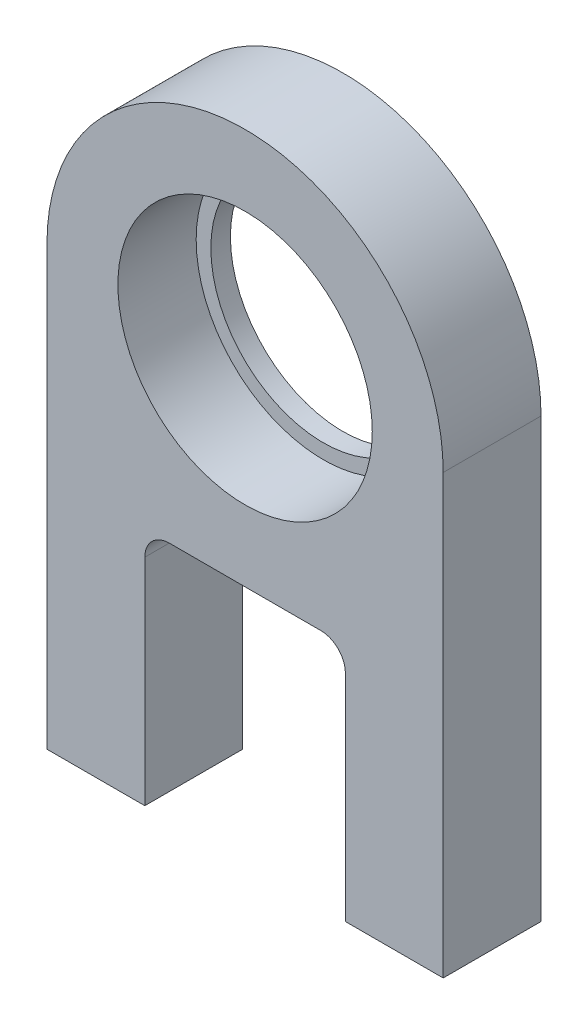
ISO-10303-21;
HEADER;
FILE_DESCRIPTION(('STEP AP214'),'2;1');
FILE_NAME('part.step','',(''),(''),'','','');
FILE_SCHEMA(('AUTOMOTIVE_DESIGN { 1 0 10303 214 1 1 1 1 }'));
ENDSEC;
DATA;
#1=APPLICATION_CONTEXT('core data for automotive mechanical design processes');
#2=APPLICATION_PROTOCOL_DEFINITION('international standard','automotive_design',2000,#1);
#3=PRODUCT_CONTEXT('',#1,'mechanical');
#4=PRODUCT('Part','Part','',(#3));
#5=PRODUCT_RELATED_PRODUCT_CATEGORY('part','',(#4));
#6=PRODUCT_DEFINITION_FORMATION('','',#4);
#7=PRODUCT_DEFINITION_CONTEXT('part definition',#1,'design');
#8=PRODUCT_DEFINITION('design','',#6,#7);
#9=PRODUCT_DEFINITION_SHAPE('','',#8);
#10=(LENGTH_UNIT() NAMED_UNIT(*) SI_UNIT(.MILLI.,.METRE.));
#11=(NAMED_UNIT(*) PLANE_ANGLE_UNIT() SI_UNIT($,.RADIAN.));
#12=(NAMED_UNIT(*) SI_UNIT($,.STERADIAN.) SOLID_ANGLE_UNIT());
#13=UNCERTAINTY_MEASURE_WITH_UNIT(LENGTH_MEASURE(1.E-05),#10,'distance_accuracy_value','');
#14=(GEOMETRIC_REPRESENTATION_CONTEXT(3) GLOBAL_UNCERTAINTY_ASSIGNED_CONTEXT((#13)) GLOBAL_UNIT_ASSIGNED_CONTEXT((#10,
#11,#12)) REPRESENTATION_CONTEXT('',''));
#15=CARTESIAN_POINT('',(0.,0.,0.));
#16=DIRECTION('',(0.,0.,1.));
#17=DIRECTION('',(1.,0.,0.));
#18=AXIS2_PLACEMENT_3D('',#15,#16,#17);
#19=CARTESIAN_POINT('',(0.,0.,-5.));
#20=DIRECTION('',(0.,0.,1.));
#21=DIRECTION('',(1.,0.,0.));
#22=AXIS2_PLACEMENT_3D('',#19,#20,#21);
#23=CYLINDRICAL_SURFACE('',#22,13.);
#24=CARTESIAN_POINT('',(0.,0.,5.));
#25=DIRECTION('',(0.,0.,1.));
#26=DIRECTION('',(1.,0.,0.));
#27=AXIS2_PLACEMENT_3D('',#24,#25,#26);
#28=CIRCLE('',#27,13.);
#29=CARTESIAN_POINT('',(13.,0.,5.));
#30=VERTEX_POINT('',#29);
#31=EDGE_CURVE('E144',#30,#30,#28,.T.);
#32=ORIENTED_EDGE('',*,*,#31,.T.);
#33=EDGE_LOOP('',(#32));
#34=FACE_BOUND('',#33,.T.);
#35=CARTESIAN_POINT('',(0.,0.,-3.));
#36=DIRECTION('',(0.,0.,-1.));
#37=DIRECTION('',(-1.,0.,0.));
#38=AXIS2_PLACEMENT_3D('',#35,#36,#37);
#39=CIRCLE('',#38,13.);
#40=CARTESIAN_POINT('',(-13.,0.,-3.));
#41=VERTEX_POINT('',#40);
#42=EDGE_CURVE('E197',#41,#41,#39,.F.);
#43=ORIENTED_EDGE('',*,*,#42,.F.);
#44=EDGE_LOOP('',(#43));
#45=FACE_BOUND('',#44,.T.);
#46=ADVANCED_FACE('F38',(#34,#45),#23,.F.);
#47=CARTESIAN_POINT('',(0.,0.,-5.));
#48=DIRECTION('',(0.,0.,1.));
#49=DIRECTION('',(1.,0.,0.));
#50=AXIS2_PLACEMENT_3D('',#47,#48,#49);
#51=CYLINDRICAL_SURFACE('',#50,20.25);
#52=DIRECTION('',(0.,0.,1.));
#53=VECTOR('',#52,1.);
#54=CARTESIAN_POINT('',(-20.25,0.,-5.));
#55=LINE('',#54,#53);
#56=CARTESIAN_POINT('',(-20.25,0.,-5.));
#57=VERTEX_POINT('',#56);
#58=CARTESIAN_POINT('',(-20.25,0.,5.));
#59=VERTEX_POINT('',#58);
#60=EDGE_CURVE('E194',#57,#59,#55,.T.);
#61=ORIENTED_EDGE('',*,*,#60,.T.);
#62=CARTESIAN_POINT('',(0.,0.,5.));
#63=DIRECTION('',(0.,0.,1.));
#64=DIRECTION('',(1.,0.,0.));
#65=AXIS2_PLACEMENT_3D('',#62,#63,#64);
#66=CIRCLE('',#65,20.25);
#67=CARTESIAN_POINT('',(20.25,0.,5.));
#68=VERTEX_POINT('',#67);
#69=EDGE_CURVE('E149',#68,#59,#66,.T.);
#70=ORIENTED_EDGE('',*,*,#69,.F.);
#71=DIRECTION('',(0.,0.,1.));
#72=VECTOR('',#71,1.);
#73=CARTESIAN_POINT('',(20.25,0.,-5.));
#74=LINE('',#73,#72);
#75=CARTESIAN_POINT('',(20.25,0.,-5.));
#76=VERTEX_POINT('',#75);
#77=EDGE_CURVE('E195',#76,#68,#74,.T.);
#78=ORIENTED_EDGE('',*,*,#77,.F.);
#79=CARTESIAN_POINT('',(0.,0.,-5.));
#80=DIRECTION('',(0.,0.,1.));
#81=DIRECTION('',(1.,0.,0.));
#82=AXIS2_PLACEMENT_3D('',#79,#80,#81);
#83=CIRCLE('',#82,20.25);
#84=EDGE_CURVE('E172',#76,#57,#83,.T.);
#85=ORIENTED_EDGE('',*,*,#84,.T.);
#86=EDGE_LOOP('',(#61,#70,#78,#85));
#87=FACE_BOUND('',#86,.T.);
#88=ADVANCED_FACE('F245',(#87),#51,.T.);
#89=CARTESIAN_POINT('',(20.25,0.,-5.));
#90=DIRECTION('',(1.,0.,0.));
#91=DIRECTION('',(0.,1.,0.));
#92=AXIS2_PLACEMENT_3D('',#89,#90,#91);
#93=PLANE('',#92);
#94=ORIENTED_EDGE('',*,*,#77,.T.);
#95=DIRECTION('',(0.,1.,0.));
#96=VECTOR('',#95,1.);
#97=CARTESIAN_POINT('',(20.25,0.,5.));
#98=LINE('',#97,#96);
#99=CARTESIAN_POINT('',(20.25,-44.75,5.));
#100=VERTEX_POINT('',#99);
#101=EDGE_CURVE('E169',#100,#68,#98,.T.);
#102=ORIENTED_EDGE('',*,*,#101,.F.);
#103=DIRECTION('',(0.,0.,1.));
#104=VECTOR('',#103,1.);
#105=CARTESIAN_POINT('',(20.25,-44.75,-5.));
#106=LINE('',#105,#104);
#107=CARTESIAN_POINT('',(20.25,-44.75,-5.));
#108=VERTEX_POINT('',#107);
#109=EDGE_CURVE('E198',#108,#100,#106,.T.);
#110=ORIENTED_EDGE('',*,*,#109,.F.);
#111=DIRECTION('',(0.,1.,0.));
#112=VECTOR('',#111,1.);
#113=CARTESIAN_POINT('',(20.25,0.,-5.));
#114=LINE('',#113,#112);
#115=EDGE_CURVE('E191',#108,#76,#114,.T.);
#116=ORIENTED_EDGE('',*,*,#115,.T.);
#117=EDGE_LOOP('',(#94,#102,#110,#116));
#118=FACE_BOUND('',#117,.T.);
#119=ADVANCED_FACE('F249',(#118),#93,.T.);
#120=CARTESIAN_POINT('',(0.,-44.75,-5.));
#121=DIRECTION('',(0.,-1.,0.));
#122=DIRECTION('',(0.,0.,-1.));
#123=AXIS2_PLACEMENT_3D('',#120,#121,#122);
#124=PLANE('',#123);
#125=CARTESIAN_POINT('',(15.75,-44.75,0.));
#126=DIRECTION('',(0.,-1.,0.));
#127=DIRECTION('',(0.,0.,-1.));
#128=AXIS2_PLACEMENT_3D('',#125,#126,#127);
#129=CIRCLE('',#128,2.09999999999999);
#130=CARTESIAN_POINT('',(15.75,-44.75,-2.09999999999999));
#131=VERTEX_POINT('',#130);
#132=EDGE_CURVE('E129',#131,#131,#129,.T.);
#133=ORIENTED_EDGE('',*,*,#132,.F.);
#134=EDGE_LOOP('',(#133));
#135=FACE_BOUND('',#134,.T.);
#136=ORIENTED_EDGE('',*,*,#109,.T.);
#137=DIRECTION('',(1.,0.,0.));
#138=VECTOR('',#137,1.);
#139=CARTESIAN_POINT('',(0.,-44.75,5.));
#140=LINE('',#139,#138);
#141=CARTESIAN_POINT('',(10.25,-44.75,5.));
#142=VERTEX_POINT('',#141);
#143=EDGE_CURVE('E166',#142,#100,#140,.T.);
#144=ORIENTED_EDGE('',*,*,#143,.F.);
#145=DIRECTION('',(0.,0.,1.));
#146=VECTOR('',#145,1.);
#147=CARTESIAN_POINT('',(10.25,-44.75,-5.));
#148=LINE('',#147,#146);
#149=CARTESIAN_POINT('',(10.25,-44.75,-5.));
#150=VERTEX_POINT('',#149);
#151=EDGE_CURVE('E200',#150,#142,#148,.T.);
#152=ORIENTED_EDGE('',*,*,#151,.F.);
#153=DIRECTION('',(1.,0.,0.));
#154=VECTOR('',#153,1.);
#155=CARTESIAN_POINT('',(0.,-44.75,-5.));
#156=LINE('',#155,#154);
#157=EDGE_CURVE('E188',#150,#108,#156,.T.);
#158=ORIENTED_EDGE('',*,*,#157,.T.);
#159=EDGE_LOOP('',(#136,#144,#152,#158));
#160=FACE_BOUND('',#159,.T.);
#161=ADVANCED_FACE('F253',(#135,#160),#124,.T.);
#162=CARTESIAN_POINT('',(10.25,0.,-5.));
#163=DIRECTION('',(-1.,0.,0.));
#164=DIRECTION('',(0.,-1.,0.));
#165=AXIS2_PLACEMENT_3D('',#162,#163,#164);
#166=PLANE('',#165);
#167=DIRECTION('',(0.,-1.,0.));
#168=VECTOR('',#167,1.);
#169=CARTESIAN_POINT('',(10.25,0.,5.));
#170=LINE('',#169,#168);
#171=CARTESIAN_POINT('',(10.25,-22.75,5.));
#172=VERTEX_POINT('',#171);
#173=EDGE_CURVE('E164',#172,#142,#170,.T.);
#174=ORIENTED_EDGE('',*,*,#173,.F.);
#175=DIRECTION('',(0.,0.,1.));
#176=VECTOR('',#175,1.);
#177=CARTESIAN_POINT('',(10.25,-22.75,-5.));
#178=LINE('',#177,#176);
#179=CARTESIAN_POINT('',(10.25,-22.75,-5.));
#180=VERTEX_POINT('',#179);
#181=EDGE_CURVE('E215',#172,#180,#178,.F.);
#182=ORIENTED_EDGE('',*,*,#181,.T.);
#183=DIRECTION('',(0.,-1.,0.));
#184=VECTOR('',#183,1.);
#185=CARTESIAN_POINT('',(10.25,0.,-5.));
#186=LINE('',#185,#184);
#187=EDGE_CURVE('E186',#180,#150,#186,.T.);
#188=ORIENTED_EDGE('',*,*,#187,.T.);
#189=ORIENTED_EDGE('',*,*,#151,.T.);
#190=EDGE_LOOP('',(#174,#182,#188,#189));
#191=FACE_BOUND('',#190,.T.);
#192=ADVANCED_FACE('F261',(#191),#166,.T.);
#193=CARTESIAN_POINT('',(0.,-20.25,-5.));
#194=DIRECTION('',(0.,-1.,0.));
#195=DIRECTION('',(0.,0.,-1.));
#196=AXIS2_PLACEMENT_3D('',#193,#194,#195);
#197=PLANE('',#196);
#198=DIRECTION('',(1.,0.,0.));
#199=VECTOR('',#198,1.);
#200=CARTESIAN_POINT('',(0.,-20.25,-5.));
#201=LINE('',#200,#199);
#202=CARTESIAN_POINT('',(-7.74999999999999,-20.25,-5.));
#203=VERTEX_POINT('',#202);
#204=CARTESIAN_POINT('',(7.74999999999999,-20.25,-5.));
#205=VERTEX_POINT('',#204);
#206=EDGE_CURVE('E183',#203,#205,#201,.T.);
#207=ORIENTED_EDGE('',*,*,#206,.T.);
#208=DIRECTION('',(0.,0.,1.));
#209=VECTOR('',#208,1.);
#210=CARTESIAN_POINT('',(7.74999999999999,-20.25,5.));
#211=LINE('',#210,#209);
#212=CARTESIAN_POINT('',(7.74999999999999,-20.25,5.));
#213=VERTEX_POINT('',#212);
#214=EDGE_CURVE('E212',#205,#213,#211,.T.);
#215=ORIENTED_EDGE('',*,*,#214,.T.);
#216=DIRECTION('',(1.,0.,0.));
#217=VECTOR('',#216,1.);
#218=CARTESIAN_POINT('',(0.,-20.25,5.));
#219=LINE('',#218,#217);
#220=CARTESIAN_POINT('',(-7.74999999999999,-20.25,5.));
#221=VERTEX_POINT('',#220);
#222=EDGE_CURVE('E161',#221,#213,#219,.T.);
#223=ORIENTED_EDGE('',*,*,#222,.F.);
#224=DIRECTION('',(0.,0.,1.));
#225=VECTOR('',#224,1.);
#226=CARTESIAN_POINT('',(-7.74999999999999,-20.25,-5.));
#227=LINE('',#226,#225);
#228=EDGE_CURVE('E210',#221,#203,#227,.F.);
#229=ORIENTED_EDGE('',*,*,#228,.T.);
#230=EDGE_LOOP('',(#207,#215,#223,#229));
#231=FACE_BOUND('',#230,.T.);
#232=ADVANCED_FACE('F227',(#231),#197,.T.);
#233=CARTESIAN_POINT('',(-10.25,0.,-5.));
#234=DIRECTION('',(1.,0.,0.));
#235=DIRECTION('',(0.,1.,0.));
#236=AXIS2_PLACEMENT_3D('',#233,#234,#235);
#237=PLANE('',#236);
#238=DIRECTION('',(0.,1.,0.));
#239=VECTOR('',#238,1.);
#240=CARTESIAN_POINT('',(-10.25,0.,-5.));
#241=LINE('',#240,#239);
#242=CARTESIAN_POINT('',(-10.25,-44.75,-5.));
#243=VERTEX_POINT('',#242);
#244=CARTESIAN_POINT('',(-10.25,-22.75,-5.));
#245=VERTEX_POINT('',#244);
#246=EDGE_CURVE('E181',#243,#245,#241,.T.);
#247=ORIENTED_EDGE('',*,*,#246,.T.);
#248=DIRECTION('',(0.,0.,1.));
#249=VECTOR('',#248,1.);
#250=CARTESIAN_POINT('',(-10.25,-22.75,5.));
#251=LINE('',#250,#249);
#252=CARTESIAN_POINT('',(-10.25,-22.75,5.));
#253=VERTEX_POINT('',#252);
#254=EDGE_CURVE('E217',#245,#253,#251,.T.);
#255=ORIENTED_EDGE('',*,*,#254,.T.);
#256=DIRECTION('',(0.,1.,0.));
#257=VECTOR('',#256,1.);
#258=CARTESIAN_POINT('',(-10.25,0.,5.));
#259=LINE('',#258,#257);
#260=CARTESIAN_POINT('',(-10.25,-44.75,5.));
#261=VERTEX_POINT('',#260);
#262=EDGE_CURVE('E158',#261,#253,#259,.T.);
#263=ORIENTED_EDGE('',*,*,#262,.F.);
#264=DIRECTION('',(0.,0.,1.));
#265=VECTOR('',#264,1.);
#266=CARTESIAN_POINT('',(-10.25,-44.75,-5.));
#267=LINE('',#266,#265);
#268=EDGE_CURVE('E203',#243,#261,#267,.T.);
#269=ORIENTED_EDGE('',*,*,#268,.F.);
#270=EDGE_LOOP('',(#247,#255,#263,#269));
#271=FACE_BOUND('',#270,.T.);
#272=ADVANCED_FACE('F230',(#271),#237,.T.);
#273=CARTESIAN_POINT('',(0.,-44.75,-5.));
#274=DIRECTION('',(0.,-1.,0.));
#275=DIRECTION('',(0.,0.,-1.));
#276=AXIS2_PLACEMENT_3D('',#273,#274,#275);
#277=PLANE('',#276);
#278=CARTESIAN_POINT('',(-15.75,-44.75,0.));
#279=DIRECTION('',(0.,-1.,0.));
#280=DIRECTION('',(0.,0.,-1.));
#281=AXIS2_PLACEMENT_3D('',#278,#279,#280);
#282=CIRCLE('',#281,2.09999999999999);
#283=CARTESIAN_POINT('',(-15.75,-44.75,-2.09999999999999));
#284=VERTEX_POINT('',#283);
#285=EDGE_CURVE('E130',#284,#284,#282,.T.);
#286=ORIENTED_EDGE('',*,*,#285,.F.);
#287=EDGE_LOOP('',(#286));
#288=FACE_BOUND('',#287,.T.);
#289=ORIENTED_EDGE('',*,*,#268,.T.);
#290=DIRECTION('',(1.,0.,0.));
#291=VECTOR('',#290,1.);
#292=CARTESIAN_POINT('',(0.,-44.75,5.));
#293=LINE('',#292,#291);
#294=CARTESIAN_POINT('',(-20.25,-44.75,5.));
#295=VERTEX_POINT('',#294);
#296=EDGE_CURVE('E155',#295,#261,#293,.T.);
#297=ORIENTED_EDGE('',*,*,#296,.F.);
#298=DIRECTION('',(0.,0.,1.));
#299=VECTOR('',#298,1.);
#300=CARTESIAN_POINT('',(-20.25,-44.75,-5.));
#301=LINE('',#300,#299);
#302=CARTESIAN_POINT('',(-20.25,-44.75,-5.));
#303=VERTEX_POINT('',#302);
#304=EDGE_CURVE('E205',#303,#295,#301,.T.);
#305=ORIENTED_EDGE('',*,*,#304,.F.);
#306=DIRECTION('',(1.,0.,0.));
#307=VECTOR('',#306,1.);
#308=CARTESIAN_POINT('',(0.,-44.75,-5.));
#309=LINE('',#308,#307);
#310=EDGE_CURVE('E178',#303,#243,#309,.T.);
#311=ORIENTED_EDGE('',*,*,#310,.T.);
#312=EDGE_LOOP('',(#289,#297,#305,#311));
#313=FACE_BOUND('',#312,.T.);
#314=ADVANCED_FACE('F237',(#288,#313),#277,.T.);
#315=CARTESIAN_POINT('',(-20.25,0.,-5.));
#316=DIRECTION('',(-1.,0.,0.));
#317=DIRECTION('',(0.,-1.,0.));
#318=AXIS2_PLACEMENT_3D('',#315,#316,#317);
#319=PLANE('',#318);
#320=ORIENTED_EDGE('',*,*,#304,.T.);
#321=DIRECTION('',(0.,-1.,0.));
#322=VECTOR('',#321,1.);
#323=CARTESIAN_POINT('',(-20.25,0.,5.));
#324=LINE('',#323,#322);
#325=EDGE_CURVE('E152',#59,#295,#324,.T.);
#326=ORIENTED_EDGE('',*,*,#325,.F.);
#327=ORIENTED_EDGE('',*,*,#60,.F.);
#328=DIRECTION('',(0.,-1.,0.));
#329=VECTOR('',#328,1.);
#330=CARTESIAN_POINT('',(-20.25,0.,-5.));
#331=LINE('',#330,#329);
#332=EDGE_CURVE('E175',#57,#303,#331,.T.);
#333=ORIENTED_EDGE('',*,*,#332,.T.);
#334=EDGE_LOOP('',(#320,#326,#327,#333));
#335=FACE_BOUND('',#334,.T.);
#336=ADVANCED_FACE('F241',(#335),#319,.T.);
#337=CARTESIAN_POINT('',(0.,0.,-5.));
#338=DIRECTION('',(0.,0.,1.));
#339=DIRECTION('',(1.,0.,0.));
#340=AXIS2_PLACEMENT_3D('',#337,#338,#339);
#341=PLANE('',#340);
#342=ORIENTED_EDGE('',*,*,#84,.F.);
#343=ORIENTED_EDGE('',*,*,#115,.F.);
#344=ORIENTED_EDGE('',*,*,#157,.F.);
#345=ORIENTED_EDGE('',*,*,#187,.F.);
#346=CARTESIAN_POINT('',(7.74999999999999,-22.75,-5.));
#347=DIRECTION('',(0.,0.,1.));
#348=DIRECTION('',(1.,0.,0.));
#349=AXIS2_PLACEMENT_3D('',#346,#347,#348);
#350=CIRCLE('',#349,2.5);
#351=EDGE_CURVE('E221',#180,#205,#350,.T.);
#352=ORIENTED_EDGE('',*,*,#351,.T.);
#353=ORIENTED_EDGE('',*,*,#206,.F.);
#354=CARTESIAN_POINT('',(-7.74999999999999,-22.75,-5.));
#355=DIRECTION('',(0.,0.,1.));
#356=DIRECTION('',(1.,0.,0.));
#357=AXIS2_PLACEMENT_3D('',#354,#355,#356);
#358=CIRCLE('',#357,2.5);
#359=EDGE_CURVE('E11',#203,#245,#358,.T.);
#360=ORIENTED_EDGE('',*,*,#359,.T.);
#361=ORIENTED_EDGE('',*,*,#246,.F.);
#362=ORIENTED_EDGE('',*,*,#310,.F.);
#363=ORIENTED_EDGE('',*,*,#332,.F.);
#364=EDGE_LOOP('',(#342,#343,#344,#345,#352,#353,#360,#361,#362,#363));
#365=FACE_BOUND('',#364,.T.);
#366=CARTESIAN_POINT('',(0.,0.,-5.));
#367=DIRECTION('',(0.,0.,-1.));
#368=DIRECTION('',(-1.,0.,0.));
#369=AXIS2_PLACEMENT_3D('',#366,#367,#368);
#370=CIRCLE('',#369,11.5);
#371=CARTESIAN_POINT('',(-11.5,0.,-5.));
#372=VERTEX_POINT('',#371);
#373=EDGE_CURVE('E140',#372,#372,#370,.T.);
#374=ORIENTED_EDGE('',*,*,#373,.F.);
#375=EDGE_LOOP('',(#374));
#376=FACE_BOUND('',#375,.T.);
#377=ADVANCED_FACE('F233',(#365,#376),#341,.F.);
#378=CARTESIAN_POINT('',(0.,0.,5.));
#379=DIRECTION('',(0.,0.,1.));
#380=DIRECTION('',(1.,0.,0.));
#381=AXIS2_PLACEMENT_3D('',#378,#379,#380);
#382=PLANE('',#381);
#383=ORIENTED_EDGE('',*,*,#31,.F.);
#384=EDGE_LOOP('',(#383));
#385=FACE_BOUND('',#384,.T.);
#386=ORIENTED_EDGE('',*,*,#69,.T.);
#387=ORIENTED_EDGE('',*,*,#325,.T.);
#388=ORIENTED_EDGE('',*,*,#296,.T.);
#389=ORIENTED_EDGE('',*,*,#262,.T.);
#390=CARTESIAN_POINT('',(-7.74999999999999,-22.75,5.));
#391=DIRECTION('',(0.,0.,1.));
#392=DIRECTION('',(1.,0.,0.));
#393=AXIS2_PLACEMENT_3D('',#390,#391,#392);
#394=CIRCLE('',#393,2.5);
#395=EDGE_CURVE('E46',#253,#221,#394,.F.);
#396=ORIENTED_EDGE('',*,*,#395,.T.);
#397=ORIENTED_EDGE('',*,*,#222,.T.);
#398=CARTESIAN_POINT('',(7.74999999999999,-22.75,5.));
#399=DIRECTION('',(0.,0.,1.));
#400=DIRECTION('',(1.,0.,0.));
#401=AXIS2_PLACEMENT_3D('',#398,#399,#400);
#402=CIRCLE('',#401,2.5);
#403=EDGE_CURVE('E219',#213,#172,#402,.F.);
#404=ORIENTED_EDGE('',*,*,#403,.T.);
#405=ORIENTED_EDGE('',*,*,#173,.T.);
#406=ORIENTED_EDGE('',*,*,#143,.T.);
#407=ORIENTED_EDGE('',*,*,#101,.T.);
#408=EDGE_LOOP('',(#386,#387,#388,#389,#396,#397,#404,#405,#406,#407));
#409=FACE_BOUND('',#408,.T.);
#410=ADVANCED_FACE('F224',(#385,#409),#382,.T.);
#411=CARTESIAN_POINT('',(0.,0.,-3.));
#412=DIRECTION('',(0.,0.,-1.));
#413=DIRECTION('',(-1.,0.,0.));
#414=AXIS2_PLACEMENT_3D('',#411,#412,#413);
#415=PLANE('',#414);
#416=CARTESIAN_POINT('',(0.,0.,-3.));
#417=DIRECTION('',(0.,0.,-1.));
#418=DIRECTION('',(-1.,0.,0.));
#419=AXIS2_PLACEMENT_3D('',#416,#417,#418);
#420=CIRCLE('',#419,11.5);
#421=CARTESIAN_POINT('',(-11.5,0.,-3.));
#422=VERTEX_POINT('',#421);
#423=EDGE_CURVE('E141',#422,#422,#420,.T.);
#424=ORIENTED_EDGE('',*,*,#423,.T.);
#425=EDGE_LOOP('',(#424));
#426=FACE_BOUND('',#425,.T.);
#427=ORIENTED_EDGE('',*,*,#42,.T.);
#428=EDGE_LOOP('',(#427));
#429=FACE_BOUND('',#428,.T.);
#430=ADVANCED_FACE('F300',(#426,#429),#415,.F.);
#431=CARTESIAN_POINT('',(0.,0.,-3.));
#432=DIRECTION('',(0.,0.,-1.));
#433=DIRECTION('',(-1.,0.,0.));
#434=AXIS2_PLACEMENT_3D('',#431,#432,#433);
#435=CYLINDRICAL_SURFACE('',#434,11.5);
#436=ORIENTED_EDGE('',*,*,#423,.F.);
#437=EDGE_LOOP('',(#436));
#438=FACE_BOUND('',#437,.T.);
#439=ORIENTED_EDGE('',*,*,#373,.T.);
#440=EDGE_LOOP('',(#439));
#441=FACE_BOUND('',#440,.T.);
#442=ADVANCED_FACE('F296',(#438,#441),#435,.F.);
#443=CARTESIAN_POINT('',(15.75,-29.75,0.));
#444=DIRECTION('',(0.,-1.,0.));
#445=DIRECTION('',(0.,0.,-1.));
#446=AXIS2_PLACEMENT_3D('',#443,#444,#445);
#447=CONICAL_SURFACE('',#446,2.09999999999999,1.02974425867665);
#448=CARTESIAN_POINT('',(15.75,-28.4881927000421,0.));
#449=VERTEX_POINT('',#448);
#450=VERTEX_LOOP('',#449);
#451=FACE_BOUND('',#450,.T.);
#452=CARTESIAN_POINT('',(15.75,-29.75,0.));
#453=DIRECTION('',(0.,-1.,0.));
#454=DIRECTION('',(0.,0.,-1.));
#455=AXIS2_PLACEMENT_3D('',#452,#453,#454);
#456=CIRCLE('',#455,2.09999999999999);
#457=CARTESIAN_POINT('',(15.75,-29.75,-2.09999999999999));
#458=VERTEX_POINT('',#457);
#459=EDGE_CURVE('E133',#458,#458,#456,.T.);
#460=ORIENTED_EDGE('',*,*,#459,.T.);
#461=EDGE_LOOP('',(#460));
#462=FACE_BOUND('',#461,.T.);
#463=ADVANCED_FACE('F292',(#451,#462),#447,.F.);
#464=CARTESIAN_POINT('',(15.75,-44.75,0.));
#465=DIRECTION('',(0.,-1.,0.));
#466=DIRECTION('',(0.,0.,-1.));
#467=AXIS2_PLACEMENT_3D('',#464,#465,#466);
#468=CYLINDRICAL_SURFACE('',#467,2.09999999999999);
#469=ORIENTED_EDGE('',*,*,#459,.F.);
#470=EDGE_LOOP('',(#469));
#471=FACE_BOUND('',#470,.T.);
#472=ORIENTED_EDGE('',*,*,#132,.T.);
#473=EDGE_LOOP('',(#472));
#474=FACE_BOUND('',#473,.T.);
#475=ADVANCED_FACE('F123',(#471,#474),#468,.F.);
#476=CARTESIAN_POINT('',(-15.75,-29.75,0.));
#477=DIRECTION('',(0.,-1.,0.));
#478=DIRECTION('',(0.,0.,-1.));
#479=AXIS2_PLACEMENT_3D('',#476,#477,#478);
#480=CONICAL_SURFACE('',#479,2.09999999999999,1.02974425867665);
#481=CARTESIAN_POINT('',(-15.75,-28.4881927000421,0.));
#482=VERTEX_POINT('',#481);
#483=VERTEX_LOOP('',#482);
#484=FACE_BOUND('',#483,.T.);
#485=CARTESIAN_POINT('',(-15.75,-29.75,0.));
#486=DIRECTION('',(0.,-1.,0.));
#487=DIRECTION('',(0.,0.,-1.));
#488=AXIS2_PLACEMENT_3D('',#485,#486,#487);
#489=CIRCLE('',#488,2.09999999999999);
#490=CARTESIAN_POINT('',(-15.75,-29.75,-2.09999999999999));
#491=VERTEX_POINT('',#490);
#492=EDGE_CURVE('E127',#491,#491,#489,.T.);
#493=ORIENTED_EDGE('',*,*,#492,.T.);
#494=EDGE_LOOP('',(#493));
#495=FACE_BOUND('',#494,.T.);
#496=ADVANCED_FACE('F119',(#484,#495),#480,.F.);
#497=CARTESIAN_POINT('',(-15.75,-44.75,0.));
#498=DIRECTION('',(0.,-1.,0.));
#499=DIRECTION('',(0.,0.,-1.));
#500=AXIS2_PLACEMENT_3D('',#497,#498,#499);
#501=CYLINDRICAL_SURFACE('',#500,2.09999999999999);
#502=ORIENTED_EDGE('',*,*,#492,.F.);
#503=EDGE_LOOP('',(#502));
#504=FACE_BOUND('',#503,.T.);
#505=ORIENTED_EDGE('',*,*,#285,.T.);
#506=EDGE_LOOP('',(#505));
#507=FACE_BOUND('',#506,.T.);
#508=ADVANCED_FACE('F122',(#504,#507),#501,.F.);
#509=CARTESIAN_POINT('',(7.74999999999999,-22.75,-5.));
#510=DIRECTION('',(0.,0.,-1.));
#511=DIRECTION('',(-1.,0.,0.));
#512=AXIS2_PLACEMENT_3D('',#509,#510,#511);
#513=CYLINDRICAL_SURFACE('',#512,2.5);
#514=ORIENTED_EDGE('',*,*,#351,.F.);
#515=ORIENTED_EDGE('',*,*,#181,.F.);
#516=ORIENTED_EDGE('',*,*,#403,.F.);
#517=ORIENTED_EDGE('',*,*,#214,.F.);
#518=EDGE_LOOP('',(#514,#515,#516,#517));
#519=FACE_BOUND('',#518,.T.);
#520=ADVANCED_FACE('F259',(#519),#513,.F.);
#521=CARTESIAN_POINT('',(-7.74999999999999,-22.75,-5.));
#522=DIRECTION('',(0.,0.,-1.));
#523=DIRECTION('',(-1.,0.,0.));
#524=AXIS2_PLACEMENT_3D('',#521,#522,#523);
#525=CYLINDRICAL_SURFACE('',#524,2.5);
#526=ORIENTED_EDGE('',*,*,#359,.F.);
#527=ORIENTED_EDGE('',*,*,#228,.F.);
#528=ORIENTED_EDGE('',*,*,#395,.F.);
#529=ORIENTED_EDGE('',*,*,#254,.F.);
#530=EDGE_LOOP('',(#526,#527,#528,#529));
#531=FACE_BOUND('',#530,.T.);
#532=ADVANCED_FACE('F40',(#531),#525,.F.);
#533=CLOSED_SHELL('',(#46,#88,#119,#161,#192,#232,#272,#314,#336,#377,#410,#430,#442,#463,#475,
#496,#508,#520,#532));
#534=MANIFOLD_SOLID_BREP('B2',#533);
#535=ADVANCED_BREP_SHAPE_REPRESENTATION('',(#18,#534),#14);
#536=SHAPE_DEFINITION_REPRESENTATION(#9,#535);
ENDSEC;
END-ISO-10303-21;
